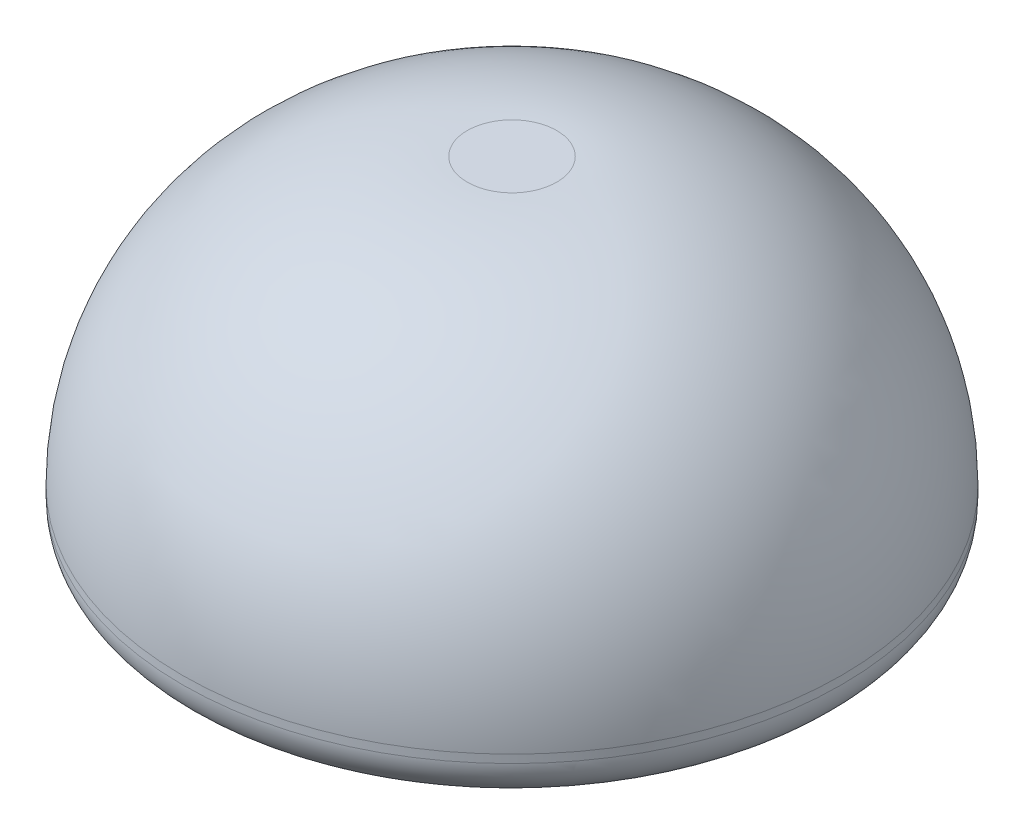
ISO-10303-21;
HEADER;
FILE_DESCRIPTION(('STEP AP214'),'2;1');
FILE_NAME('part.step','',(''),(''),'','','');
FILE_SCHEMA(('AUTOMOTIVE_DESIGN { 1 0 10303 214 1 1 1 1 }'));
ENDSEC;
DATA;
#1=APPLICATION_CONTEXT('core data for automotive mechanical design processes');
#2=APPLICATION_PROTOCOL_DEFINITION('international standard','automotive_design',2000,#1);
#3=PRODUCT_CONTEXT('',#1,'mechanical');
#4=PRODUCT('Part','Part','',(#3));
#5=PRODUCT_RELATED_PRODUCT_CATEGORY('part','',(#4));
#6=PRODUCT_DEFINITION_FORMATION('','',#4);
#7=PRODUCT_DEFINITION_CONTEXT('part definition',#1,'design');
#8=PRODUCT_DEFINITION('design','',#6,#7);
#9=PRODUCT_DEFINITION_SHAPE('','',#8);
#10=(LENGTH_UNIT() NAMED_UNIT(*) SI_UNIT(.MILLI.,.METRE.));
#11=(NAMED_UNIT(*) PLANE_ANGLE_UNIT() SI_UNIT($,.RADIAN.));
#12=(NAMED_UNIT(*) SI_UNIT($,.STERADIAN.) SOLID_ANGLE_UNIT());
#13=UNCERTAINTY_MEASURE_WITH_UNIT(LENGTH_MEASURE(1.E-05),#10,'distance_accuracy_value','');
#14=(GEOMETRIC_REPRESENTATION_CONTEXT(3) GLOBAL_UNCERTAINTY_ASSIGNED_CONTEXT((#13)) GLOBAL_UNIT_ASSIGNED_CONTEXT((#10,
#11,#12)) REPRESENTATION_CONTEXT('',''));
#15=CARTESIAN_POINT('',(0.,0.,0.));
#16=DIRECTION('',(0.,0.,1.));
#17=DIRECTION('',(1.,0.,0.));
#18=AXIS2_PLACEMENT_3D('',#15,#16,#17);
#19=CARTESIAN_POINT('',(0.,8.2,0.));
#20=DIRECTION('',(0.,-1.,0.));
#21=DIRECTION('',(0.,0.,-1.));
#22=AXIS2_PLACEMENT_3D('',#19,#20,#21);
#23=CYLINDRICAL_SURFACE('',#22,8.1);
#24=CARTESIAN_POINT('',(0.,1.,0.));
#25=DIRECTION('',(0.,1.,0.));
#26=DIRECTION('',(0.,0.,1.));
#27=AXIS2_PLACEMENT_3D('',#24,#25,#26);
#28=CIRCLE('',#27,8.1);
#29=CARTESIAN_POINT('',(0.,1.,8.1));
#30=VERTEX_POINT('',#29);
#31=EDGE_CURVE('E51',#30,#30,#28,.T.);
#32=ORIENTED_EDGE('',*,*,#31,.T.);
#33=EDGE_LOOP('',(#32));
#34=FACE_BOUND('',#33,.T.);
#35=CARTESIAN_POINT('',(0.,1.2,0.));
#36=DIRECTION('',(0.,1.,0.));
#37=DIRECTION('',(0.,0.,1.));
#38=AXIS2_PLACEMENT_3D('',#35,#36,#37);
#39=CIRCLE('',#38,8.1);
#40=CARTESIAN_POINT('',(0.,1.2,8.1));
#41=VERTEX_POINT('',#40);
#42=EDGE_CURVE('E56',#41,#41,#39,.F.);
#43=ORIENTED_EDGE('',*,*,#42,.T.);
#44=EDGE_LOOP('',(#43));
#45=FACE_BOUND('',#44,.T.);
#46=ADVANCED_FACE('F43',(#34,#45),#23,.T.);
#47=CARTESIAN_POINT('',(0.,8.2,0.));
#48=DIRECTION('',(0.,1.,0.));
#49=DIRECTION('',(0.,0.,1.));
#50=AXIS2_PLACEMENT_3D('',#47,#48,#49);
#51=PLANE('',#50);
#52=CARTESIAN_POINT('',(0.,8.2,0.));
#53=DIRECTION('',(0.,1.,0.));
#54=DIRECTION('',(0.,0.,1.));
#55=AXIS2_PLACEMENT_3D('',#52,#53,#54);
#56=CIRCLE('',#55,1.1);
#57=CARTESIAN_POINT('',(0.,8.2,1.1));
#58=VERTEX_POINT('',#57);
#59=EDGE_CURVE('E61',#58,#58,#56,.T.);
#60=ORIENTED_EDGE('',*,*,#59,.T.);
#61=EDGE_LOOP('',(#60));
#62=FACE_BOUND('',#61,.T.);
#63=ADVANCED_FACE('F68',(#62),#51,.T.);
#64=CARTESIAN_POINT('',(0.,0.,0.));
#65=DIRECTION('',(0.,1.,0.));
#66=DIRECTION('',(0.,0.,1.));
#67=AXIS2_PLACEMENT_3D('',#64,#65,#66);
#68=PLANE('',#67);
#69=CARTESIAN_POINT('',(0.,0.,0.));
#70=DIRECTION('',(0.,1.,0.));
#71=DIRECTION('',(0.,0.,1.));
#72=AXIS2_PLACEMENT_3D('',#69,#70,#71);
#73=CIRCLE('',#72,7.1);
#74=CARTESIAN_POINT('',(0.,0.,7.1));
#75=VERTEX_POINT('',#74);
#76=EDGE_CURVE('E10',#75,#75,#73,.F.);
#77=ORIENTED_EDGE('',*,*,#76,.T.);
#78=EDGE_LOOP('',(#77));
#79=FACE_BOUND('',#78,.T.);
#80=ADVANCED_FACE('F72',(#79),#68,.F.);
#81=CARTESIAN_POINT('',(0.,1.2,0.));
#82=DIRECTION('',(0.,1.,0.));
#83=DIRECTION('',(0.,0.,1.));
#84=AXIS2_PLACEMENT_3D('',#81,#82,#83);
#85=DEGENERATE_TOROIDAL_SURFACE('',#84,1.1,7.,.T.);
#86=ORIENTED_EDGE('',*,*,#42,.F.);
#87=EDGE_LOOP('',(#86));
#88=FACE_BOUND('',#87,.T.);
#89=ORIENTED_EDGE('',*,*,#59,.F.);
#90=EDGE_LOOP('',(#89));
#91=FACE_BOUND('',#90,.T.);
#92=ADVANCED_FACE('F70',(#88,#91),#85,.T.);
#93=CARTESIAN_POINT('',(0.,1.,0.));
#94=DIRECTION('',(0.,1.,0.));
#95=DIRECTION('',(0.,0.,1.));
#96=AXIS2_PLACEMENT_3D('',#93,#94,#95);
#97=TOROIDAL_SURFACE('',#96,7.1,1.);
#98=ORIENTED_EDGE('',*,*,#76,.F.);
#99=EDGE_LOOP('',(#98));
#100=FACE_BOUND('',#99,.T.);
#101=ORIENTED_EDGE('',*,*,#31,.F.);
#102=EDGE_LOOP('',(#101));
#103=FACE_BOUND('',#102,.T.);
#104=ADVANCED_FACE('F45',(#100,#103),#97,.T.);
#105=CLOSED_SHELL('',(#46,#63,#80,#92,#104));
#106=MANIFOLD_SOLID_BREP('B2',#105);
#107=ADVANCED_BREP_SHAPE_REPRESENTATION('',(#18,#106),#14);
#108=SHAPE_DEFINITION_REPRESENTATION(#9,#107);
ENDSEC;
END-ISO-10303-21;
